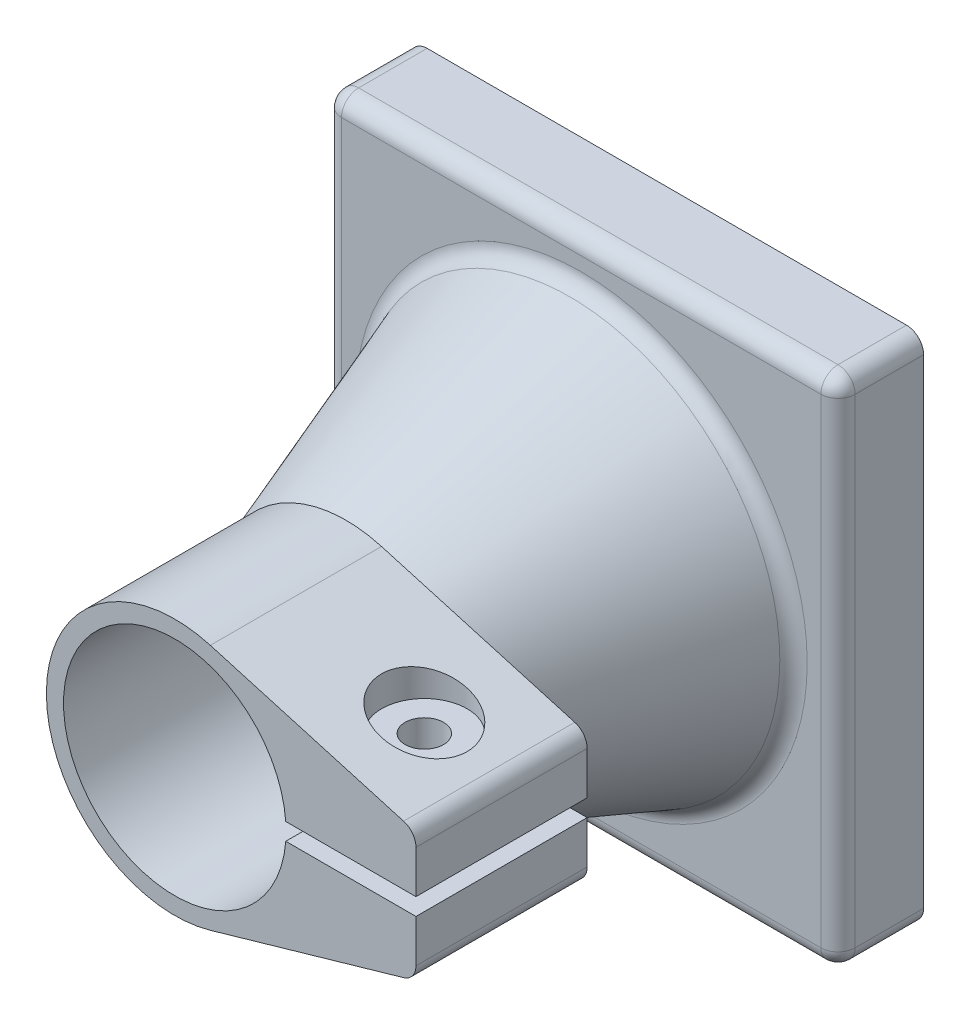
ISO-10303-21;
HEADER;
FILE_DESCRIPTION(('STEP AP214'),'2;1');
FILE_NAME('part.step','',(''),(''),'','','');
FILE_SCHEMA(('AUTOMOTIVE_DESIGN { 1 0 10303 214 1 1 1 1 }'));
ENDSEC;
DATA;
#1=APPLICATION_CONTEXT('core data for automotive mechanical design processes');
#2=APPLICATION_PROTOCOL_DEFINITION('international standard','automotive_design',2000,#1);
#3=PRODUCT_CONTEXT('',#1,'mechanical');
#4=PRODUCT('Part','Part','',(#3));
#5=PRODUCT_RELATED_PRODUCT_CATEGORY('part','',(#4));
#6=PRODUCT_DEFINITION_FORMATION('','',#4);
#7=PRODUCT_DEFINITION_CONTEXT('part definition',#1,'design');
#8=PRODUCT_DEFINITION('design','',#6,#7);
#9=PRODUCT_DEFINITION_SHAPE('','',#8);
#10=(LENGTH_UNIT() NAMED_UNIT(*) SI_UNIT(.MILLI.,.METRE.));
#11=(NAMED_UNIT(*) PLANE_ANGLE_UNIT() SI_UNIT($,.RADIAN.));
#12=(NAMED_UNIT(*) SI_UNIT($,.STERADIAN.) SOLID_ANGLE_UNIT());
#13=UNCERTAINTY_MEASURE_WITH_UNIT(LENGTH_MEASURE(1.E-05),#10,'distance_accuracy_value','');
#14=(GEOMETRIC_REPRESENTATION_CONTEXT(3) GLOBAL_UNCERTAINTY_ASSIGNED_CONTEXT((#13)) GLOBAL_UNIT_ASSIGNED_CONTEXT((#10,
#11,#12)) REPRESENTATION_CONTEXT('',''));
#15=CARTESIAN_POINT('',(0.,0.,0.));
#16=DIRECTION('',(0.,0.,1.));
#17=DIRECTION('',(1.,0.,0.));
#18=AXIS2_PLACEMENT_3D('',#15,#16,#17);
#19=CARTESIAN_POINT('',(19.1488859578134,-16.5906320768049,47.4747741945465));
#20=DIRECTION('',(0.,1.,0.));
#21=DIRECTION('',(0.,0.,1.));
#22=AXIS2_PLACEMENT_3D('',#19,#20,#21);
#23=CYLINDRICAL_SURFACE('',#22,2.25);
#24=CARTESIAN_POINT('',(19.1488859578134,1.,47.4747741945465));
#25=DIRECTION('',(0.,1.,0.));
#26=DIRECTION('',(-1.,0.,0.));
#27=AXIS2_PLACEMENT_3D('',#24,#25,#26);
#28=CIRCLE('',#27,2.25);
#29=CARTESIAN_POINT('',(16.8988859578134,1.,47.4747741945465));
#30=VERTEX_POINT('',#29);
#31=EDGE_CURVE('E217',#30,#30,#28,.F.);
#32=ORIENTED_EDGE('',*,*,#31,.T.);
#33=EDGE_LOOP('',(#32));
#34=FACE_BOUND('',#33,.T.);
#35=CARTESIAN_POINT('',(19.1488859578134,8.,47.4747741945465));
#36=DIRECTION('',(0.,1.,0.));
#37=DIRECTION('',(0.,0.,1.));
#38=AXIS2_PLACEMENT_3D('',#35,#36,#37);
#39=CIRCLE('',#38,2.25);
#40=CARTESIAN_POINT('',(19.1488859578134,8.,49.7247741945465));
#41=VERTEX_POINT('',#40);
#42=EDGE_CURVE('E227',#41,#41,#39,.F.);
#43=ORIENTED_EDGE('',*,*,#42,.F.);
#44=EDGE_LOOP('',(#43));
#45=FACE_BOUND('',#44,.T.);
#46=ADVANCED_FACE('F35',(#34,#45),#23,.F.);
#47=CARTESIAN_POINT('',(28.1735691739616,7.5,37.4747741945464));
#48=DIRECTION('',(1.,0.,0.));
#49=DIRECTION('',(0.,0.,-1.));
#50=AXIS2_PLACEMENT_3D('',#47,#48,#49);
#51=PLANE('',#50);
#52=DIRECTION('',(0.,0.,1.));
#53=VECTOR('',#52,1.);
#54=CARTESIAN_POINT('',(28.1735691739616,1.,22.1317753175475));
#55=LINE('',#54,#53);
#56=CARTESIAN_POINT('',(28.1735691739616,1.,37.4747741945464));
#57=VERTEX_POINT('',#56);
#58=CARTESIAN_POINT('',(28.1735691739616,1.,57.4747741945465));
#59=VERTEX_POINT('',#58);
#60=EDGE_CURVE('E211',#57,#59,#55,.T.);
#61=ORIENTED_EDGE('',*,*,#60,.F.);
#62=DIRECTION('',(0.,1.,0.));
#63=VECTOR('',#62,1.);
#64=CARTESIAN_POINT('',(28.1735691739616,7.5,37.4747741945464));
#65=LINE('',#64,#63);
#66=CARTESIAN_POINT('',(28.1735691739616,5.99444923726153,37.4747741945464));
#67=VERTEX_POINT('',#66);
#68=EDGE_CURVE('E235',#57,#67,#65,.T.);
#69=ORIENTED_EDGE('',*,*,#68,.T.);
#70=DIRECTION('',(0.,0.,1.));
#71=VECTOR('',#70,1.);
#72=CARTESIAN_POINT('',(28.1735691739616,5.99444923726153,37.4747741945464));
#73=LINE('',#72,#71);
#74=CARTESIAN_POINT('',(28.1735691739616,5.99444923726153,57.4747741945465));
#75=VERTEX_POINT('',#74);
#76=EDGE_CURVE('E366',#67,#75,#73,.T.);
#77=ORIENTED_EDGE('',*,*,#76,.T.);
#78=DIRECTION('',(0.,1.,0.));
#79=VECTOR('',#78,1.);
#80=CARTESIAN_POINT('',(28.1735691739616,7.5,57.4747741945465));
#81=LINE('',#80,#79);
#82=EDGE_CURVE('E245',#59,#75,#81,.T.);
#83=ORIENTED_EDGE('',*,*,#82,.F.);
#84=EDGE_LOOP('',(#61,#69,#77,#83));
#85=FACE_BOUND('',#84,.T.);
#86=ADVANCED_FACE('F409',(#85),#51,.T.);
#87=CARTESIAN_POINT('',(0.,0.,37.4747741945464));
#88=DIRECTION('',(0.,0.,-1.));
#89=DIRECTION('',(-1.,0.,0.));
#90=AXIS2_PLACEMENT_3D('',#87,#88,#89);
#91=PLANE('',#90);
#92=DIRECTION('',(-1.,0.,0.));
#93=VECTOR('',#92,1.);
#94=CARTESIAN_POINT('',(28.1735691739616,1.,37.4747741945464));
#95=LINE('',#94,#93);
#96=CARTESIAN_POINT('',(14.9666295470958,0.999999999999998,37.4747741945464));
#97=VERTEX_POINT('',#96);
#98=EDGE_CURVE('E190',#57,#97,#95,.T.);
#99=ORIENTED_EDGE('',*,*,#98,.T.);
#100=CARTESIAN_POINT('',(0.,0.,37.4747741945464));
#101=DIRECTION('',(0.,0.,-1.));
#102=DIRECTION('',(-1.,0.,0.));
#103=AXIS2_PLACEMENT_3D('',#100,#101,#102);
#104=CIRCLE('',#103,15.);
#105=CARTESIAN_POINT('',(4.14888595781337,14.4148099296889,37.4747741945464));
#106=VERTEX_POINT('',#105);
#107=EDGE_CURVE('E229',#106,#97,#104,.T.);
#108=ORIENTED_EDGE('',*,*,#107,.F.);
#109=DIRECTION('',(-0.96098732864593,0.276592397187558,0.));
#110=VECTOR('',#109,1.);
#111=CARTESIAN_POINT('',(4.14888595781337,14.4148099296889,37.4747741945464));
#112=LINE('',#111,#110);
#113=CARTESIAN_POINT('',(26.7267539683367,7.91642389455339,37.4747741945464));
#114=VERTEX_POINT('',#113);
#115=EDGE_CURVE('E239',#114,#106,#112,.T.);
#116=ORIENTED_EDGE('',*,*,#115,.F.);
#117=CARTESIAN_POINT('',(26.1735691739616,5.99444923726153,37.4747741945464));
#118=DIRECTION('',(0.,0.,-1.));
#119=DIRECTION('',(-1.,0.,0.));
#120=AXIS2_PLACEMENT_3D('',#117,#118,#119);
#121=CIRCLE('',#120,2.);
#122=EDGE_CURVE('E376',#114,#67,#121,.T.);
#123=ORIENTED_EDGE('',*,*,#122,.T.);
#124=ORIENTED_EDGE('',*,*,#68,.F.);
#125=EDGE_LOOP('',(#99,#108,#116,#123,#124));
#126=FACE_BOUND('',#125,.T.);
#127=ADVANCED_FACE('F415',(#126),#91,.T.);
#128=CARTESIAN_POINT('',(4.14888595781337,-14.4148099296889,37.4747741945464));
#129=DIRECTION('',(0.276592397187558,-0.96098732864593,0.));
#130=DIRECTION('',(0.96098732864593,0.276592397187558,0.));
#131=AXIS2_PLACEMENT_3D('',#128,#129,#130);
#132=PLANE('',#131);
#133=DIRECTION('',(0.96098732864593,0.276592397187558,0.));
#134=VECTOR('',#133,1.);
#135=CARTESIAN_POINT('',(4.14888595781337,-14.4148099296889,37.4747741945464));
#136=LINE('',#135,#134);
#137=CARTESIAN_POINT('',(4.14888595781337,-14.4148099296889,37.4747741945464));
#138=VERTEX_POINT('',#137);
#139=CARTESIAN_POINT('',(26.7267539683367,-7.91642389455339,37.4747741945464));
#140=VERTEX_POINT('',#139);
#141=EDGE_CURVE('E232',#138,#140,#136,.T.);
#142=ORIENTED_EDGE('',*,*,#141,.T.);
#143=DIRECTION('',(0.,0.,1.));
#144=VECTOR('',#143,1.);
#145=CARTESIAN_POINT('',(26.7267539683367,-7.91642389455339,37.4747741945464));
#146=LINE('',#145,#144);
#147=CARTESIAN_POINT('',(26.7267539683367,-7.91642389455339,57.4747741945465));
#148=VERTEX_POINT('',#147);
#149=EDGE_CURVE('E43',#140,#148,#146,.T.);
#150=ORIENTED_EDGE('',*,*,#149,.T.);
#151=DIRECTION('',(0.96098732864593,0.276592397187558,0.));
#152=VECTOR('',#151,1.);
#153=CARTESIAN_POINT('',(4.14888595781337,-14.4148099296889,57.4747741945465));
#154=LINE('',#153,#152);
#155=CARTESIAN_POINT('',(4.14888595781337,-14.4148099296889,57.4747741945465));
#156=VERTEX_POINT('',#155);
#157=EDGE_CURVE('E242',#156,#148,#154,.T.);
#158=ORIENTED_EDGE('',*,*,#157,.F.);
#159=DIRECTION('',(0.,0.,1.));
#160=VECTOR('',#159,1.);
#161=CARTESIAN_POINT('',(4.14888595781337,-14.4148099296889,37.4747741945464));
#162=LINE('',#161,#160);
#163=EDGE_CURVE('E241',#138,#156,#162,.T.);
#164=ORIENTED_EDGE('',*,*,#163,.F.);
#165=EDGE_LOOP('',(#142,#150,#158,#164));
#166=FACE_BOUND('',#165,.T.);
#167=CARTESIAN_POINT('',(19.1488859578134,-10.0974939421209,47.4747741945465));
#168=DIRECTION('',(0.276592397187558,-0.96098732864593,0.));
#169=DIRECTION('',(-0.96098732864593,-0.276592397187558,0.));
#170=AXIS2_PLACEMENT_3D('',#167,#168,#169);
#171=ELLIPSE('',#170,5.20298223603552,5.);
#172=CARTESIAN_POINT('',(14.1488859578134,-11.5365992713103,47.4747741945465));
#173=VERTEX_POINT('',#172);
#174=EDGE_CURVE('E223',#173,#173,#171,.F.);
#175=ORIENTED_EDGE('',*,*,#174,.T.);
#176=EDGE_LOOP('',(#175));
#177=FACE_BOUND('',#176,.T.);
#178=ADVANCED_FACE('F423',(#166,#177),#132,.T.);
#179=CARTESIAN_POINT('',(19.1488859578134,-0.999999999999999,47.4747741945465));
#180=DIRECTION('',(0.,-1.,0.));
#181=DIRECTION('',(1.,0.,0.));
#182=AXIS2_PLACEMENT_3D('',#179,#180,#181);
#183=CIRCLE('',#182,2.25);
#184=CARTESIAN_POINT('',(21.3988859578134,-0.999999999999999,47.4747741945465));
#185=VERTEX_POINT('',#184);
#186=EDGE_CURVE('E214',#185,#185,#183,.F.);
#187=ORIENTED_EDGE('',*,*,#186,.T.);
#188=EDGE_LOOP('',(#187));
#189=FACE_BOUND('',#188,.T.);
#190=CARTESIAN_POINT('',(19.1488859578134,-8.,47.4747741945465));
#191=DIRECTION('',(0.,1.,0.));
#192=DIRECTION('',(0.,0.,1.));
#193=AXIS2_PLACEMENT_3D('',#190,#191,#192);
#194=CIRCLE('',#193,2.25);
#195=CARTESIAN_POINT('',(19.1488859578134,-8.,49.7247741945465));
#196=VERTEX_POINT('',#195);
#197=EDGE_CURVE('E228',#196,#196,#194,.F.);
#198=ORIENTED_EDGE('',*,*,#197,.T.);
#199=EDGE_LOOP('',(#198));
#200=FACE_BOUND('',#199,.T.);
#201=ADVANCED_FACE('F389',(#189,#200),#23,.F.);
#202=CARTESIAN_POINT('',(0.,0.,10.));
#203=DIRECTION('',(0.,0.,1.));
#204=DIRECTION('',(1.,0.,0.));
#205=AXIS2_PLACEMENT_3D('',#202,#203,#204);
#206=PLANE('',#205);
#207=CARTESIAN_POINT('',(0.,0.,10.));
#208=DIRECTION('',(0.,0.,1.));
#209=DIRECTION('',(1.,0.,0.));
#210=AXIS2_PLACEMENT_3D('',#207,#208,#209);
#211=CIRCLE('',#210,26.4004150764194);
#212=CARTESIAN_POINT('',(26.4004150764194,0.,10.));
#213=VERTEX_POINT('',#212);
#214=EDGE_CURVE('E297',#213,#213,#211,.F.);
#215=ORIENTED_EDGE('',*,*,#214,.T.);
#216=EDGE_LOOP('',(#215));
#217=FACE_BOUND('',#216,.T.);
#218=DIRECTION('',(0.,1.,0.));
#219=VECTOR('',#218,1.);
#220=CARTESIAN_POINT('',(28.,30.,10.));
#221=LINE('',#220,#219);
#222=CARTESIAN_POINT('',(28.,-28.,10.));
#223=VERTEX_POINT('',#222);
#224=CARTESIAN_POINT('',(28.,28.,10.));
#225=VERTEX_POINT('',#224);
#226=EDGE_CURVE('E291',#223,#225,#221,.T.);
#227=ORIENTED_EDGE('',*,*,#226,.T.);
#228=DIRECTION('',(-1.,0.,0.));
#229=VECTOR('',#228,1.);
#230=CARTESIAN_POINT('',(-30.,28.,10.));
#231=LINE('',#230,#229);
#232=CARTESIAN_POINT('',(-28.,28.,10.));
#233=VERTEX_POINT('',#232);
#234=EDGE_CURVE('E294',#225,#233,#231,.T.);
#235=ORIENTED_EDGE('',*,*,#234,.T.);
#236=DIRECTION('',(0.,-1.,0.));
#237=VECTOR('',#236,1.);
#238=CARTESIAN_POINT('',(-28.,-30.,10.));
#239=LINE('',#238,#237);
#240=CARTESIAN_POINT('',(-28.,-28.,10.));
#241=VERTEX_POINT('',#240);
#242=EDGE_CURVE('E285',#233,#241,#239,.T.);
#243=ORIENTED_EDGE('',*,*,#242,.T.);
#244=DIRECTION('',(1.,0.,0.));
#245=VECTOR('',#244,1.);
#246=CARTESIAN_POINT('',(30.,-28.,10.));
#247=LINE('',#246,#245);
#248=EDGE_CURVE('E288',#241,#223,#247,.T.);
#249=ORIENTED_EDGE('',*,*,#248,.T.);
#250=EDGE_LOOP('',(#227,#235,#243,#249));
#251=FACE_BOUND('',#250,.T.);
#252=ADVANCED_FACE('F422',(#217,#251),#206,.T.);
#253=CARTESIAN_POINT('',(-30.,30.,10.));
#254=DIRECTION('',(1.,0.,0.));
#255=DIRECTION('',(0.,1.,0.));
#256=AXIS2_PLACEMENT_3D('',#253,#254,#255);
#257=PLANE('',#256);
#258=DIRECTION('',(0.,-1.,0.));
#259=VECTOR('',#258,1.);
#260=CARTESIAN_POINT('',(-30.,30.,0.));
#261=LINE('',#260,#259);
#262=CARTESIAN_POINT('',(-30.,28.,0.));
#263=VERTEX_POINT('',#262);
#264=CARTESIAN_POINT('',(-30.,-28.,0.));
#265=VERTEX_POINT('',#264);
#266=EDGE_CURVE('E269',#263,#265,#261,.T.);
#267=ORIENTED_EDGE('',*,*,#266,.T.);
#268=DIRECTION('',(0.,0.,-1.));
#269=VECTOR('',#268,1.);
#270=CARTESIAN_POINT('',(-30.,-28.,10.));
#271=LINE('',#270,#269);
#272=CARTESIAN_POINT('',(-30.,-28.,8.));
#273=VERTEX_POINT('',#272);
#274=EDGE_CURVE('E350',#265,#273,#271,.F.);
#275=ORIENTED_EDGE('',*,*,#274,.T.);
#276=DIRECTION('',(0.,-1.,0.));
#277=VECTOR('',#276,1.);
#278=CARTESIAN_POINT('',(-30.,30.,8.));
#279=LINE('',#278,#277);
#280=CARTESIAN_POINT('',(-30.,28.,8.));
#281=VERTEX_POINT('',#280);
#282=EDGE_CURVE('E309',#273,#281,#279,.F.);
#283=ORIENTED_EDGE('',*,*,#282,.T.);
#284=DIRECTION('',(0.,0.,-1.));
#285=VECTOR('',#284,1.);
#286=CARTESIAN_POINT('',(-30.,28.,10.));
#287=LINE('',#286,#285);
#288=EDGE_CURVE('E348',#281,#263,#287,.T.);
#289=ORIENTED_EDGE('',*,*,#288,.T.);
#290=EDGE_LOOP('',(#267,#275,#283,#289));
#291=FACE_BOUND('',#290,.T.);
#292=ADVANCED_FACE('F429',(#291),#257,.F.);
#293=CARTESIAN_POINT('',(-30.,-30.,10.));
#294=DIRECTION('',(0.,1.,0.));
#295=DIRECTION('',(0.,0.,1.));
#296=AXIS2_PLACEMENT_3D('',#293,#294,#295);
#297=PLANE('',#296);
#298=DIRECTION('',(1.,0.,0.));
#299=VECTOR('',#298,1.);
#300=CARTESIAN_POINT('',(-30.,-30.,0.));
#301=LINE('',#300,#299);
#302=CARTESIAN_POINT('',(-28.,-30.,0.));
#303=VERTEX_POINT('',#302);
#304=CARTESIAN_POINT('',(28.,-30.,0.));
#305=VERTEX_POINT('',#304);
#306=EDGE_CURVE('E273',#303,#305,#301,.T.);
#307=ORIENTED_EDGE('',*,*,#306,.T.);
#308=DIRECTION('',(0.,0.,-1.));
#309=VECTOR('',#308,1.);
#310=CARTESIAN_POINT('',(28.,-30.,10.));
#311=LINE('',#310,#309);
#312=CARTESIAN_POINT('',(28.,-30.,8.));
#313=VERTEX_POINT('',#312);
#314=EDGE_CURVE('E346',#305,#313,#311,.F.);
#315=ORIENTED_EDGE('',*,*,#314,.T.);
#316=DIRECTION('',(1.,0.,0.));
#317=VECTOR('',#316,1.);
#318=CARTESIAN_POINT('',(-30.,-30.,8.));
#319=LINE('',#318,#317);
#320=CARTESIAN_POINT('',(-28.,-30.,8.));
#321=VERTEX_POINT('',#320);
#322=EDGE_CURVE('E306',#313,#321,#319,.F.);
#323=ORIENTED_EDGE('',*,*,#322,.T.);
#324=DIRECTION('',(0.,0.,-1.));
#325=VECTOR('',#324,1.);
#326=CARTESIAN_POINT('',(-28.,-30.,10.));
#327=LINE('',#326,#325);
#328=EDGE_CURVE('E344',#321,#303,#327,.T.);
#329=ORIENTED_EDGE('',*,*,#328,.T.);
#330=EDGE_LOOP('',(#307,#315,#323,#329));
#331=FACE_BOUND('',#330,.T.);
#332=ADVANCED_FACE('F729',(#331),#297,.F.);
#333=CARTESIAN_POINT('',(30.,30.,10.));
#334=DIRECTION('',(-1.,0.,0.));
#335=DIRECTION('',(0.,-1.,0.));
#336=AXIS2_PLACEMENT_3D('',#333,#334,#335);
#337=PLANE('',#336);
#338=DIRECTION('',(0.,1.,0.));
#339=VECTOR('',#338,1.);
#340=CARTESIAN_POINT('',(30.,-30.,8.));
#341=LINE('',#340,#339);
#342=CARTESIAN_POINT('',(30.,28.,8.));
#343=VERTEX_POINT('',#342);
#344=CARTESIAN_POINT('',(30.,-28.,8.));
#345=VERTEX_POINT('',#344);
#346=EDGE_CURVE('E303',#343,#345,#341,.F.);
#347=ORIENTED_EDGE('',*,*,#346,.T.);
#348=DIRECTION('',(0.,0.,-1.));
#349=VECTOR('',#348,1.);
#350=CARTESIAN_POINT('',(30.,-28.,10.));
#351=LINE('',#350,#349);
#352=CARTESIAN_POINT('',(30.,-28.,0.));
#353=VERTEX_POINT('',#352);
#354=EDGE_CURVE('E334',#345,#353,#351,.T.);
#355=ORIENTED_EDGE('',*,*,#354,.T.);
#356=DIRECTION('',(0.,1.,0.));
#357=VECTOR('',#356,1.);
#358=CARTESIAN_POINT('',(30.,30.,0.));
#359=LINE('',#358,#357);
#360=CARTESIAN_POINT('',(30.,28.,0.));
#361=VERTEX_POINT('',#360);
#362=EDGE_CURVE('E276',#353,#361,#359,.T.);
#363=ORIENTED_EDGE('',*,*,#362,.T.);
#364=DIRECTION('',(0.,0.,-1.));
#365=VECTOR('',#364,1.);
#366=CARTESIAN_POINT('',(30.,28.,10.));
#367=LINE('',#366,#365);
#368=EDGE_CURVE('E332',#361,#343,#367,.F.);
#369=ORIENTED_EDGE('',*,*,#368,.T.);
#370=EDGE_LOOP('',(#347,#355,#363,#369));
#371=FACE_BOUND('',#370,.T.);
#372=ADVANCED_FACE('F721',(#371),#337,.F.);
#373=CARTESIAN_POINT('',(-30.,30.,10.));
#374=DIRECTION('',(0.,-1.,0.));
#375=DIRECTION('',(0.,0.,-1.));
#376=AXIS2_PLACEMENT_3D('',#373,#374,#375);
#377=PLANE('',#376);
#378=DIRECTION('',(-1.,0.,0.));
#379=VECTOR('',#378,1.);
#380=CARTESIAN_POINT('',(30.,30.,8.));
#381=LINE('',#380,#379);
#382=CARTESIAN_POINT('',(-28.,30.,8.));
#383=VERTEX_POINT('',#382);
#384=CARTESIAN_POINT('',(28.,30.,8.));
#385=VERTEX_POINT('',#384);
#386=EDGE_CURVE('E300',#383,#385,#381,.F.);
#387=ORIENTED_EDGE('',*,*,#386,.T.);
#388=DIRECTION('',(0.,0.,-1.));
#389=VECTOR('',#388,1.);
#390=CARTESIAN_POINT('',(28.,30.,10.));
#391=LINE('',#390,#389);
#392=CARTESIAN_POINT('',(28.,30.,0.));
#393=VERTEX_POINT('',#392);
#394=EDGE_CURVE('E354',#385,#393,#391,.T.);
#395=ORIENTED_EDGE('',*,*,#394,.T.);
#396=DIRECTION('',(-1.,0.,0.));
#397=VECTOR('',#396,1.);
#398=CARTESIAN_POINT('',(-30.,30.,0.));
#399=LINE('',#398,#397);
#400=CARTESIAN_POINT('',(-28.,30.,0.));
#401=VERTEX_POINT('',#400);
#402=EDGE_CURVE('E279',#393,#401,#399,.T.);
#403=ORIENTED_EDGE('',*,*,#402,.T.);
#404=DIRECTION('',(0.,0.,-1.));
#405=VECTOR('',#404,1.);
#406=CARTESIAN_POINT('',(-28.,30.,10.));
#407=LINE('',#406,#405);
#408=EDGE_CURVE('E352',#401,#383,#407,.F.);
#409=ORIENTED_EDGE('',*,*,#408,.T.);
#410=EDGE_LOOP('',(#387,#395,#403,#409));
#411=FACE_BOUND('',#410,.T.);
#412=ADVANCED_FACE('F713',(#411),#377,.F.);
#413=CARTESIAN_POINT('',(0.,0.,0.));
#414=DIRECTION('',(0.,0.,1.));
#415=DIRECTION('',(1.,0.,0.));
#416=AXIS2_PLACEMENT_3D('',#413,#414,#415);
#417=PLANE('',#416);
#418=ORIENTED_EDGE('',*,*,#362,.F.);
#419=CARTESIAN_POINT('',(28.,-28.,0.));
#420=DIRECTION('',(0.,0.,1.));
#421=DIRECTION('',(1.,0.,0.));
#422=AXIS2_PLACEMENT_3D('',#419,#420,#421);
#423=CIRCLE('',#422,2.);
#424=EDGE_CURVE('E342',#353,#305,#423,.F.);
#425=ORIENTED_EDGE('',*,*,#424,.T.);
#426=ORIENTED_EDGE('',*,*,#306,.F.);
#427=CARTESIAN_POINT('',(-28.,-28.,0.));
#428=DIRECTION('',(0.,0.,1.));
#429=DIRECTION('',(1.,0.,0.));
#430=AXIS2_PLACEMENT_3D('',#427,#428,#429);
#431=CIRCLE('',#430,2.);
#432=EDGE_CURVE('E340',#303,#265,#431,.F.);
#433=ORIENTED_EDGE('',*,*,#432,.T.);
#434=ORIENTED_EDGE('',*,*,#266,.F.);
#435=CARTESIAN_POINT('',(-28.,28.,0.));
#436=DIRECTION('',(0.,0.,1.));
#437=DIRECTION('',(1.,0.,0.));
#438=AXIS2_PLACEMENT_3D('',#435,#436,#437);
#439=CIRCLE('',#438,2.);
#440=EDGE_CURVE('E336',#263,#401,#439,.F.);
#441=ORIENTED_EDGE('',*,*,#440,.T.);
#442=ORIENTED_EDGE('',*,*,#402,.F.);
#443=CARTESIAN_POINT('',(28.,28.,0.));
#444=DIRECTION('',(0.,0.,1.));
#445=DIRECTION('',(1.,0.,0.));
#446=AXIS2_PLACEMENT_3D('',#443,#444,#445);
#447=CIRCLE('',#446,2.);
#448=EDGE_CURVE('E338',#393,#361,#447,.F.);
#449=ORIENTED_EDGE('',*,*,#448,.T.);
#450=EDGE_LOOP('',(#418,#425,#426,#433,#434,#441,#442,#449));
#451=FACE_BOUND('',#450,.T.);
#452=ADVANCED_FACE('F706',(#451),#417,.F.);
#453=CARTESIAN_POINT('',(0.,0.,10.));
#454=DIRECTION('',(0.,0.,-1.));
#455=DIRECTION('',(-1.,0.,0.));
#456=AXIS2_PLACEMENT_3D('',#453,#454,#455);
#457=CONICAL_SURFACE('',#456,25.,0.349065850398863);
#458=CARTESIAN_POINT('',(0.,0.,11.3159597133487));
#459=DIRECTION('',(0.,0.,1.));
#460=DIRECTION('',(1.,0.,0.));
#461=AXIS2_PLACEMENT_3D('',#458,#459,#460);
#462=CIRCLE('',#461,24.5210298348476);
#463=CARTESIAN_POINT('',(24.5210298348476,0.,11.3159597133487));
#464=VERTEX_POINT('',#463);
#465=EDGE_CURVE('E282',#464,#464,#462,.T.);
#466=ORIENTED_EDGE('',*,*,#465,.T.);
#467=EDGE_LOOP('',(#466));
#468=FACE_BOUND('',#467,.T.);
#469=CARTESIAN_POINT('',(0.,0.,37.4747741945464));
#470=DIRECTION('',(0.,0.,1.));
#471=DIRECTION('',(1.,0.,0.));
#472=AXIS2_PLACEMENT_3D('',#469,#470,#471);
#473=CIRCLE('',#472,15.);
#474=EDGE_CURVE('E266',#106,#138,#473,.T.);
#475=ORIENTED_EDGE('',*,*,#474,.F.);
#476=ORIENTED_EDGE('',*,*,#107,.T.);
#477=CARTESIAN_POINT('',(14.9666295470958,-0.999999999999998,37.4747741945464));
#478=VERTEX_POINT('',#477);
#479=EDGE_CURVE('E187',#97,#478,#104,.T.);
#480=ORIENTED_EDGE('',*,*,#479,.T.);
#481=EDGE_CURVE('E233',#478,#138,#104,.T.);
#482=ORIENTED_EDGE('',*,*,#481,.T.);
#483=EDGE_LOOP('',(#475,#476,#480,#482));
#484=FACE_BOUND('',#483,.T.);
#485=ADVANCED_FACE('F698',(#468,#484),#457,.T.);
#486=CARTESIAN_POINT('',(0.,0.,12.));
#487=DIRECTION('',(0.,0.,1.));
#488=DIRECTION('',(1.,0.,0.));
#489=AXIS2_PLACEMENT_3D('',#486,#487,#488);
#490=TOROIDAL_SURFACE('',#489,26.4004150764194,2.);
#491=ORIENTED_EDGE('',*,*,#214,.F.);
#492=EDGE_LOOP('',(#491));
#493=FACE_BOUND('',#492,.T.);
#494=ORIENTED_EDGE('',*,*,#465,.F.);
#495=EDGE_LOOP('',(#494));
#496=FACE_BOUND('',#495,.T.);
#497=ADVANCED_FACE('F689',(#493,#496),#490,.F.);
#498=CARTESIAN_POINT('',(0.,-28.,8.));
#499=DIRECTION('',(-1.,0.,0.));
#500=DIRECTION('',(0.,0.,1.));
#501=AXIS2_PLACEMENT_3D('',#498,#499,#500);
#502=CYLINDRICAL_SURFACE('',#501,2.);
#503=ORIENTED_EDGE('',*,*,#322,.F.);
#504=CARTESIAN_POINT('',(28.,-28.,8.));
#505=DIRECTION('',(-1.,0.,0.));
#506=DIRECTION('',(0.,0.,1.));
#507=AXIS2_PLACEMENT_3D('',#504,#505,#506);
#508=CIRCLE('',#507,2.);
#509=EDGE_CURVE('E319',#313,#223,#508,.T.);
#510=ORIENTED_EDGE('',*,*,#509,.T.);
#511=ORIENTED_EDGE('',*,*,#248,.F.);
#512=CARTESIAN_POINT('',(-28.,-28.,8.));
#513=DIRECTION('',(-1.,0.,0.));
#514=DIRECTION('',(0.,0.,1.));
#515=AXIS2_PLACEMENT_3D('',#512,#513,#514);
#516=CIRCLE('',#515,2.);
#517=EDGE_CURVE('E317',#241,#321,#516,.F.);
#518=ORIENTED_EDGE('',*,*,#517,.T.);
#519=EDGE_LOOP('',(#503,#510,#511,#518));
#520=FACE_BOUND('',#519,.T.);
#521=ADVANCED_FACE('F681',(#520),#502,.T.);
#522=CARTESIAN_POINT('',(28.,0.,8.));
#523=DIRECTION('',(0.,-1.,0.));
#524=DIRECTION('',(1.,0.,0.));
#525=AXIS2_PLACEMENT_3D('',#522,#523,#524);
#526=CYLINDRICAL_SURFACE('',#525,2.);
#527=ORIENTED_EDGE('',*,*,#226,.F.);
#528=CARTESIAN_POINT('',(28.,-28.,8.));
#529=DIRECTION('',(0.,-1.,0.));
#530=DIRECTION('',(1.,0.,0.));
#531=AXIS2_PLACEMENT_3D('',#528,#529,#530);
#532=CIRCLE('',#531,2.);
#533=EDGE_CURVE('E314',#223,#345,#532,.F.);
#534=ORIENTED_EDGE('',*,*,#533,.T.);
#535=ORIENTED_EDGE('',*,*,#346,.F.);
#536=CARTESIAN_POINT('',(28.,28.,8.));
#537=DIRECTION('',(0.,-1.,0.));
#538=DIRECTION('',(1.,0.,0.));
#539=AXIS2_PLACEMENT_3D('',#536,#537,#538);
#540=CIRCLE('',#539,2.);
#541=EDGE_CURVE('E312',#343,#225,#540,.T.);
#542=ORIENTED_EDGE('',*,*,#541,.T.);
#543=EDGE_LOOP('',(#527,#534,#535,#542));
#544=FACE_BOUND('',#543,.T.);
#545=ADVANCED_FACE('F673',(#544),#526,.T.);
#546=CARTESIAN_POINT('',(-28.,0.,8.));
#547=DIRECTION('',(0.,1.,0.));
#548=DIRECTION('',(-1.,0.,0.));
#549=AXIS2_PLACEMENT_3D('',#546,#547,#548);
#550=CYLINDRICAL_SURFACE('',#549,2.);
#551=ORIENTED_EDGE('',*,*,#282,.F.);
#552=CARTESIAN_POINT('',(-28.,-28.,8.));
#553=DIRECTION('',(0.,1.,0.));
#554=DIRECTION('',(-1.,0.,0.));
#555=AXIS2_PLACEMENT_3D('',#552,#553,#554);
#556=CIRCLE('',#555,2.);
#557=EDGE_CURVE('E323',#273,#241,#556,.T.);
#558=ORIENTED_EDGE('',*,*,#557,.T.);
#559=ORIENTED_EDGE('',*,*,#242,.F.);
#560=CARTESIAN_POINT('',(-28.,28.,8.));
#561=DIRECTION('',(0.,1.,0.));
#562=DIRECTION('',(-1.,0.,0.));
#563=AXIS2_PLACEMENT_3D('',#560,#561,#562);
#564=CIRCLE('',#563,2.);
#565=EDGE_CURVE('E321',#233,#281,#564,.F.);
#566=ORIENTED_EDGE('',*,*,#565,.T.);
#567=EDGE_LOOP('',(#551,#558,#559,#566));
#568=FACE_BOUND('',#567,.T.);
#569=ADVANCED_FACE('F665',(#568),#550,.T.);
#570=CARTESIAN_POINT('',(0.,28.,8.));
#571=DIRECTION('',(1.,0.,0.));
#572=DIRECTION('',(0.,0.,-1.));
#573=AXIS2_PLACEMENT_3D('',#570,#571,#572);
#574=CYLINDRICAL_SURFACE('',#573,2.);
#575=ORIENTED_EDGE('',*,*,#234,.F.);
#576=CARTESIAN_POINT('',(28.,28.,8.));
#577=DIRECTION('',(1.,0.,0.));
#578=DIRECTION('',(0.,0.,-1.));
#579=AXIS2_PLACEMENT_3D('',#576,#577,#578);
#580=CIRCLE('',#579,2.);
#581=EDGE_CURVE('E329',#225,#385,#580,.F.);
#582=ORIENTED_EDGE('',*,*,#581,.T.);
#583=ORIENTED_EDGE('',*,*,#386,.F.);
#584=CARTESIAN_POINT('',(-28.,28.,8.));
#585=DIRECTION('',(1.,0.,0.));
#586=DIRECTION('',(0.,0.,-1.));
#587=AXIS2_PLACEMENT_3D('',#584,#585,#586);
#588=CIRCLE('',#587,2.);
#589=EDGE_CURVE('E326',#383,#233,#588,.T.);
#590=ORIENTED_EDGE('',*,*,#589,.T.);
#591=EDGE_LOOP('',(#575,#582,#583,#590));
#592=FACE_BOUND('',#591,.T.);
#593=ADVANCED_FACE('F657',(#592),#574,.T.);
#594=CARTESIAN_POINT('',(28.,-28.,10.));
#595=DIRECTION('',(0.,0.,-1.));
#596=DIRECTION('',(-1.,0.,0.));
#597=AXIS2_PLACEMENT_3D('',#594,#595,#596);
#598=CYLINDRICAL_SURFACE('',#597,2.);
#599=ORIENTED_EDGE('',*,*,#424,.F.);
#600=ORIENTED_EDGE('',*,*,#354,.F.);
#601=CARTESIAN_POINT('',(28.,-28.,8.));
#602=DIRECTION('',(0.,0.,1.));
#603=DIRECTION('',(1.,0.,0.));
#604=AXIS2_PLACEMENT_3D('',#601,#602,#603);
#605=CIRCLE('',#604,2.);
#606=EDGE_CURVE('E270',#313,#345,#605,.T.);
#607=ORIENTED_EDGE('',*,*,#606,.F.);
#608=ORIENTED_EDGE('',*,*,#314,.F.);
#609=EDGE_LOOP('',(#599,#600,#607,#608));
#610=FACE_BOUND('',#609,.T.);
#611=ADVANCED_FACE('F649',(#610),#598,.T.);
#612=CARTESIAN_POINT('',(28.,-28.,8.));
#613=DIRECTION('',(0.,0.,1.));
#614=DIRECTION('',(1.,0.,0.));
#615=AXIS2_PLACEMENT_3D('',#612,#613,#614);
#616=SPHERICAL_SURFACE('',#615,2.);
#617=ORIENTED_EDGE('',*,*,#533,.F.);
#618=ORIENTED_EDGE('',*,*,#509,.F.);
#619=ORIENTED_EDGE('',*,*,#606,.T.);
#620=EDGE_LOOP('',(#617,#618,#619));
#621=FACE_BOUND('',#620,.T.);
#622=ADVANCED_FACE('F641',(#621),#616,.T.);
#623=CARTESIAN_POINT('',(-28.,-28.,10.));
#624=DIRECTION('',(0.,0.,-1.));
#625=DIRECTION('',(-1.,0.,0.));
#626=AXIS2_PLACEMENT_3D('',#623,#624,#625);
#627=CYLINDRICAL_SURFACE('',#626,2.);
#628=ORIENTED_EDGE('',*,*,#432,.F.);
#629=ORIENTED_EDGE('',*,*,#328,.F.);
#630=CARTESIAN_POINT('',(-28.,-28.,8.));
#631=DIRECTION('',(0.,0.,1.));
#632=DIRECTION('',(1.,0.,0.));
#633=AXIS2_PLACEMENT_3D('',#630,#631,#632);
#634=CIRCLE('',#633,2.);
#635=EDGE_CURVE('E358',#273,#321,#634,.T.);
#636=ORIENTED_EDGE('',*,*,#635,.F.);
#637=ORIENTED_EDGE('',*,*,#274,.F.);
#638=EDGE_LOOP('',(#628,#629,#636,#637));
#639=FACE_BOUND('',#638,.T.);
#640=ADVANCED_FACE('F633',(#639),#627,.T.);
#641=CARTESIAN_POINT('',(-28.,-28.,8.));
#642=DIRECTION('',(0.,0.,1.));
#643=DIRECTION('',(1.,0.,0.));
#644=AXIS2_PLACEMENT_3D('',#641,#642,#643);
#645=SPHERICAL_SURFACE('',#644,2.);
#646=ORIENTED_EDGE('',*,*,#635,.T.);
#647=ORIENTED_EDGE('',*,*,#517,.F.);
#648=ORIENTED_EDGE('',*,*,#557,.F.);
#649=EDGE_LOOP('',(#646,#647,#648));
#650=FACE_BOUND('',#649,.T.);
#651=ADVANCED_FACE('F625',(#650),#645,.T.);
#652=CARTESIAN_POINT('',(28.,28.,10.));
#653=DIRECTION('',(0.,0.,-1.));
#654=DIRECTION('',(-1.,0.,0.));
#655=AXIS2_PLACEMENT_3D('',#652,#653,#654);
#656=CYLINDRICAL_SURFACE('',#655,2.);
#657=ORIENTED_EDGE('',*,*,#448,.F.);
#658=ORIENTED_EDGE('',*,*,#394,.F.);
#659=CARTESIAN_POINT('',(28.,28.,8.));
#660=DIRECTION('',(0.,0.,1.));
#661=DIRECTION('',(1.,0.,0.));
#662=AXIS2_PLACEMENT_3D('',#659,#660,#661);
#663=CIRCLE('',#662,2.);
#664=EDGE_CURVE('E361',#343,#385,#663,.T.);
#665=ORIENTED_EDGE('',*,*,#664,.F.);
#666=ORIENTED_EDGE('',*,*,#368,.F.);
#667=EDGE_LOOP('',(#657,#658,#665,#666));
#668=FACE_BOUND('',#667,.T.);
#669=ADVANCED_FACE('F617',(#668),#656,.T.);
#670=CARTESIAN_POINT('',(28.,28.,8.));
#671=DIRECTION('',(0.,0.,1.));
#672=DIRECTION('',(1.,0.,0.));
#673=AXIS2_PLACEMENT_3D('',#670,#671,#672);
#674=SPHERICAL_SURFACE('',#673,2.);
#675=ORIENTED_EDGE('',*,*,#581,.F.);
#676=ORIENTED_EDGE('',*,*,#541,.F.);
#677=ORIENTED_EDGE('',*,*,#664,.T.);
#678=EDGE_LOOP('',(#675,#676,#677));
#679=FACE_BOUND('',#678,.T.);
#680=ADVANCED_FACE('F609',(#679),#674,.T.);
#681=CARTESIAN_POINT('',(-28.,28.,10.));
#682=DIRECTION('',(0.,0.,-1.));
#683=DIRECTION('',(-1.,0.,0.));
#684=AXIS2_PLACEMENT_3D('',#681,#682,#683);
#685=CYLINDRICAL_SURFACE('',#684,2.);
#686=ORIENTED_EDGE('',*,*,#440,.F.);
#687=ORIENTED_EDGE('',*,*,#288,.F.);
#688=CARTESIAN_POINT('',(-28.,28.,8.));
#689=DIRECTION('',(0.,0.,1.));
#690=DIRECTION('',(1.,0.,0.));
#691=AXIS2_PLACEMENT_3D('',#688,#689,#690);
#692=CIRCLE('',#691,2.);
#693=EDGE_CURVE('E265',#383,#281,#692,.T.);
#694=ORIENTED_EDGE('',*,*,#693,.F.);
#695=ORIENTED_EDGE('',*,*,#408,.F.);
#696=EDGE_LOOP('',(#686,#687,#694,#695));
#697=FACE_BOUND('',#696,.T.);
#698=ADVANCED_FACE('F602',(#697),#685,.T.);
#699=CARTESIAN_POINT('',(-28.,28.,8.));
#700=DIRECTION('',(0.,0.,1.));
#701=DIRECTION('',(1.,0.,0.));
#702=AXIS2_PLACEMENT_3D('',#699,#700,#701);
#703=SPHERICAL_SURFACE('',#702,2.);
#704=ORIENTED_EDGE('',*,*,#693,.T.);
#705=ORIENTED_EDGE('',*,*,#565,.F.);
#706=ORIENTED_EDGE('',*,*,#589,.F.);
#707=EDGE_LOOP('',(#704,#705,#706));
#708=FACE_BOUND('',#707,.T.);
#709=ADVANCED_FACE('F559',(#708),#703,.T.);
#710=CARTESIAN_POINT('',(0.,0.,57.4747741945465));
#711=DIRECTION('',(0.,0.,1.));
#712=DIRECTION('',(1.,0.,0.));
#713=AXIS2_PLACEMENT_3D('',#710,#711,#712);
#714=PLANE('',#713);
#715=DIRECTION('',(-1.,0.,0.));
#716=VECTOR('',#715,1.);
#717=CARTESIAN_POINT('',(28.1735691739616,1.,57.4747741945465));
#718=LINE('',#717,#716);
#719=CARTESIAN_POINT('',(12.9614813968157,0.999999999999998,57.4747741945465));
#720=VERTEX_POINT('',#719);
#721=EDGE_CURVE('E198',#59,#720,#718,.T.);
#722=ORIENTED_EDGE('',*,*,#721,.F.);
#723=ORIENTED_EDGE('',*,*,#82,.T.);
#724=CARTESIAN_POINT('',(26.1735691739616,5.99444923726153,57.4747741945465));
#725=DIRECTION('',(0.,0.,1.));
#726=DIRECTION('',(1.,0.,0.));
#727=AXIS2_PLACEMENT_3D('',#724,#725,#726);
#728=CIRCLE('',#727,2.);
#729=CARTESIAN_POINT('',(26.7267539683367,7.91642389455339,57.4747741945465));
#730=VERTEX_POINT('',#729);
#731=EDGE_CURVE('E371',#75,#730,#728,.T.);
#732=ORIENTED_EDGE('',*,*,#731,.T.);
#733=DIRECTION('',(-0.96098732864593,0.276592397187558,0.));
#734=VECTOR('',#733,1.);
#735=CARTESIAN_POINT('',(4.14888595781337,14.4148099296889,57.4747741945465));
#736=LINE('',#735,#734);
#737=CARTESIAN_POINT('',(4.14888595781337,14.4148099296889,57.4747741945465));
#738=VERTEX_POINT('',#737);
#739=EDGE_CURVE('E250',#730,#738,#736,.T.);
#740=ORIENTED_EDGE('',*,*,#739,.T.);
#741=CARTESIAN_POINT('',(0.,0.,57.4747741945465));
#742=DIRECTION('',(0.,0.,1.));
#743=DIRECTION('',(1.,0.,0.));
#744=AXIS2_PLACEMENT_3D('',#741,#742,#743);
#745=CIRCLE('',#744,15.);
#746=EDGE_CURVE('E262',#738,#156,#745,.T.);
#747=ORIENTED_EDGE('',*,*,#746,.T.);
#748=ORIENTED_EDGE('',*,*,#157,.T.);
#749=CARTESIAN_POINT('',(26.1735691739616,-5.99444923726153,57.4747741945465));
#750=DIRECTION('',(0.,0.,1.));
#751=DIRECTION('',(1.,0.,0.));
#752=AXIS2_PLACEMENT_3D('',#749,#750,#751);
#753=CIRCLE('',#752,2.);
#754=CARTESIAN_POINT('',(28.1735691739616,-5.99444923726153,57.4747741945465));
#755=VERTEX_POINT('',#754);
#756=EDGE_CURVE('E369',#148,#755,#753,.T.);
#757=ORIENTED_EDGE('',*,*,#756,.T.);
#758=CARTESIAN_POINT('',(28.1735691739616,-1.,57.4747741945465));
#759=VERTEX_POINT('',#758);
#760=EDGE_CURVE('E247',#755,#759,#81,.T.);
#761=ORIENTED_EDGE('',*,*,#760,.T.);
#762=DIRECTION('',(1.,0.,0.));
#763=VECTOR('',#762,1.);
#764=CARTESIAN_POINT('',(28.1735691739616,-1.,57.4747741945465));
#765=LINE('',#764,#763);
#766=CARTESIAN_POINT('',(12.9614813968157,-0.999999999999996,57.4747741945465));
#767=VERTEX_POINT('',#766);
#768=EDGE_CURVE('E191',#767,#759,#765,.T.);
#769=ORIENTED_EDGE('',*,*,#768,.F.);
#770=CARTESIAN_POINT('',(0.,0.,57.4747741945465));
#771=DIRECTION('',(0.,0.,1.));
#772=DIRECTION('',(1.,0.,0.));
#773=AXIS2_PLACEMENT_3D('',#770,#771,#772);
#774=CIRCLE('',#773,13.);
#775=EDGE_CURVE('E260',#720,#767,#774,.T.);
#776=ORIENTED_EDGE('',*,*,#775,.F.);
#777=EDGE_LOOP('',(#722,#723,#732,#740,#747,#748,#757,#761,#769,#776));
#778=FACE_BOUND('',#777,.T.);
#779=ADVANCED_FACE('F551',(#778),#714,.T.);
#780=CARTESIAN_POINT('',(0.,0.,57.4747741945465));
#781=DIRECTION('',(0.,0.,-1.));
#782=DIRECTION('',(-1.,0.,0.));
#783=AXIS2_PLACEMENT_3D('',#780,#781,#782);
#784=CYLINDRICAL_SURFACE('',#783,15.);
#785=ORIENTED_EDGE('',*,*,#746,.F.);
#786=DIRECTION('',(0.,0.,1.));
#787=VECTOR('',#786,1.);
#788=CARTESIAN_POINT('',(4.14888595781337,14.4148099296889,37.4747741945464));
#789=LINE('',#788,#787);
#790=EDGE_CURVE('E252',#106,#738,#789,.T.);
#791=ORIENTED_EDGE('',*,*,#790,.F.);
#792=ORIENTED_EDGE('',*,*,#474,.T.);
#793=ORIENTED_EDGE('',*,*,#163,.T.);
#794=EDGE_LOOP('',(#785,#791,#792,#793));
#795=FACE_BOUND('',#794,.T.);
#796=ADVANCED_FACE('F558',(#795),#784,.T.);
#797=CARTESIAN_POINT('',(0.,0.,57.4747741945465));
#798=DIRECTION('',(0.,0.,-1.));
#799=DIRECTION('',(-1.,0.,0.));
#800=AXIS2_PLACEMENT_3D('',#797,#798,#799);
#801=CYLINDRICAL_SURFACE('',#800,13.);
#802=DIRECTION('',(0.,0.,1.));
#803=VECTOR('',#802,1.);
#804=CARTESIAN_POINT('',(12.9614813968157,0.999999999999998,22.1317753175475));
#805=LINE('',#804,#803);
#806=CARTESIAN_POINT('',(12.9614813968157,0.999999999999998,37.4747741945464));
#807=VERTEX_POINT('',#806);
#808=EDGE_CURVE('E194',#807,#720,#805,.T.);
#809=ORIENTED_EDGE('',*,*,#808,.T.);
#810=ORIENTED_EDGE('',*,*,#775,.T.);
#811=DIRECTION('',(0.,0.,1.));
#812=VECTOR('',#811,1.);
#813=CARTESIAN_POINT('',(12.9614813968157,-0.999999999999996,22.1317753175475));
#814=LINE('',#813,#812);
#815=CARTESIAN_POINT('',(12.9614813968157,-0.999999999999996,37.4747741945464));
#816=VERTEX_POINT('',#815);
#817=EDGE_CURVE('E205',#816,#767,#814,.T.);
#818=ORIENTED_EDGE('',*,*,#817,.F.);
#819=CARTESIAN_POINT('',(0.,0.,37.4747741945464));
#820=DIRECTION('',(0.,0.,-1.));
#821=DIRECTION('',(-1.,0.,0.));
#822=AXIS2_PLACEMENT_3D('',#819,#820,#821);
#823=CIRCLE('',#822,13.);
#824=EDGE_CURVE('E184',#807,#816,#823,.T.);
#825=ORIENTED_EDGE('',*,*,#824,.F.);
#826=EDGE_LOOP('',(#809,#810,#818,#825));
#827=FACE_BOUND('',#826,.T.);
#828=CARTESIAN_POINT('',(0.,0.,17.4747741945465));
#829=DIRECTION('',(0.,0.,1.));
#830=DIRECTION('',(1.,0.,0.));
#831=AXIS2_PLACEMENT_3D('',#828,#829,#830);
#832=CIRCLE('',#831,13.);
#833=CARTESIAN_POINT('',(13.,0.,17.4747741945465));
#834=VERTEX_POINT('',#833);
#835=EDGE_CURVE('E255',#834,#834,#832,.T.);
#836=ORIENTED_EDGE('',*,*,#835,.F.);
#837=EDGE_LOOP('',(#836));
#838=FACE_BOUND('',#837,.T.);
#839=ADVANCED_FACE('F203',(#827,#838),#801,.F.);
#840=CARTESIAN_POINT('',(0.,0.,17.4747741945465));
#841=DIRECTION('',(0.,0.,1.));
#842=DIRECTION('',(1.,0.,0.));
#843=AXIS2_PLACEMENT_3D('',#840,#841,#842);
#844=PLANE('',#843);
#845=ORIENTED_EDGE('',*,*,#835,.T.);
#846=EDGE_LOOP('',(#845));
#847=FACE_BOUND('',#846,.T.);
#848=ADVANCED_FACE('F547',(#847),#844,.T.);
#849=CARTESIAN_POINT('',(4.14888595781337,14.4148099296889,37.4747741945464));
#850=DIRECTION('',(0.276592397187558,0.96098732864593,0.));
#851=DIRECTION('',(-0.96098732864593,0.276592397187558,0.));
#852=AXIS2_PLACEMENT_3D('',#849,#850,#851);
#853=PLANE('',#852);
#854=CARTESIAN_POINT('',(19.1488859578134,10.0974939421209,47.4747741945465));
#855=DIRECTION('',(0.276592397187558,0.96098732864593,0.));
#856=DIRECTION('',(-0.96098732864593,0.276592397187558,0.));
#857=AXIS2_PLACEMENT_3D('',#854,#855,#856);
#858=ELLIPSE('',#857,5.20298223603552,5.);
#859=CARTESIAN_POINT('',(14.1488859578134,11.5365992713103,47.4747741945465));
#860=VERTEX_POINT('',#859);
#861=EDGE_CURVE('E246',#860,#860,#858,.T.);
#862=ORIENTED_EDGE('',*,*,#861,.F.);
#863=EDGE_LOOP('',(#862));
#864=FACE_BOUND('',#863,.T.);
#865=ORIENTED_EDGE('',*,*,#739,.F.);
#866=DIRECTION('',(0.,0.,1.));
#867=VECTOR('',#866,1.);
#868=CARTESIAN_POINT('',(26.7267539683367,7.91642389455339,37.4747741945464));
#869=LINE('',#868,#867);
#870=EDGE_CURVE('E373',#730,#114,#869,.F.);
#871=ORIENTED_EDGE('',*,*,#870,.T.);
#872=ORIENTED_EDGE('',*,*,#115,.T.);
#873=ORIENTED_EDGE('',*,*,#790,.T.);
#874=EDGE_LOOP('',(#865,#871,#872,#873));
#875=FACE_BOUND('',#874,.T.);
#876=ADVANCED_FACE('F539',(#864,#875),#853,.T.);
#877=DIRECTION('',(0.,0.,1.));
#878=VECTOR('',#877,1.);
#879=CARTESIAN_POINT('',(28.1735691739616,-1.,22.1317753175475));
#880=LINE('',#879,#878);
#881=CARTESIAN_POINT('',(28.1735691739616,-1.,37.4747741945464));
#882=VERTEX_POINT('',#881);
#883=EDGE_CURVE('E49',#882,#759,#880,.T.);
#884=ORIENTED_EDGE('',*,*,#883,.T.);
#885=ORIENTED_EDGE('',*,*,#760,.F.);
#886=DIRECTION('',(0.,0.,1.));
#887=VECTOR('',#886,1.);
#888=CARTESIAN_POINT('',(28.1735691739616,-5.99444923726153,37.4747741945464));
#889=LINE('',#888,#887);
#890=CARTESIAN_POINT('',(28.1735691739616,-5.99444923726153,37.4747741945464));
#891=VERTEX_POINT('',#890);
#892=EDGE_CURVE('E356',#755,#891,#889,.F.);
#893=ORIENTED_EDGE('',*,*,#892,.T.);
#894=EDGE_CURVE('E236',#891,#882,#65,.T.);
#895=ORIENTED_EDGE('',*,*,#894,.T.);
#896=EDGE_LOOP('',(#884,#885,#893,#895));
#897=FACE_BOUND('',#896,.T.);
#898=ADVANCED_FACE('F418',(#897),#51,.T.);
#899=DIRECTION('',(-1.,0.,0.));
#900=VECTOR('',#899,1.);
#901=CARTESIAN_POINT('',(0.,-0.999999999999996,37.4747741945464));
#902=LINE('',#901,#900);
#903=EDGE_CURVE('E11',#882,#478,#902,.T.);
#904=ORIENTED_EDGE('',*,*,#903,.F.);
#905=ORIENTED_EDGE('',*,*,#894,.F.);
#906=CARTESIAN_POINT('',(26.1735691739616,-5.99444923726153,37.4747741945464));
#907=DIRECTION('',(0.,0.,-1.));
#908=DIRECTION('',(-1.,0.,0.));
#909=AXIS2_PLACEMENT_3D('',#906,#907,#908);
#910=CIRCLE('',#909,2.);
#911=EDGE_CURVE('E57',#891,#140,#910,.T.);
#912=ORIENTED_EDGE('',*,*,#911,.T.);
#913=ORIENTED_EDGE('',*,*,#141,.F.);
#914=ORIENTED_EDGE('',*,*,#481,.F.);
#915=EDGE_LOOP('',(#904,#905,#912,#913,#914));
#916=FACE_BOUND('',#915,.T.);
#917=ADVANCED_FACE('F479',(#916),#91,.T.);
#918=CARTESIAN_POINT('',(26.1735691739616,5.99444923726153,37.4747741945464));
#919=DIRECTION('',(0.,0.,1.));
#920=DIRECTION('',(1.,0.,0.));
#921=AXIS2_PLACEMENT_3D('',#918,#919,#920);
#922=CYLINDRICAL_SURFACE('',#921,2.);
#923=ORIENTED_EDGE('',*,*,#122,.F.);
#924=ORIENTED_EDGE('',*,*,#870,.F.);
#925=ORIENTED_EDGE('',*,*,#731,.F.);
#926=ORIENTED_EDGE('',*,*,#76,.F.);
#927=EDGE_LOOP('',(#923,#924,#925,#926));
#928=FACE_BOUND('',#927,.T.);
#929=ADVANCED_FACE('F518',(#928),#922,.T.);
#930=CARTESIAN_POINT('',(26.1735691739616,-5.99444923726153,37.4747741945464));
#931=DIRECTION('',(0.,0.,1.));
#932=DIRECTION('',(1.,0.,0.));
#933=AXIS2_PLACEMENT_3D('',#930,#931,#932);
#934=CYLINDRICAL_SURFACE('',#933,2.);
#935=ORIENTED_EDGE('',*,*,#911,.F.);
#936=ORIENTED_EDGE('',*,*,#892,.F.);
#937=ORIENTED_EDGE('',*,*,#756,.F.);
#938=ORIENTED_EDGE('',*,*,#149,.F.);
#939=EDGE_LOOP('',(#935,#936,#937,#938));
#940=FACE_BOUND('',#939,.T.);
#941=ADVANCED_FACE('F37',(#940),#934,.T.);
#942=CARTESIAN_POINT('',(19.1488859578134,8.,47.4747741945465));
#943=DIRECTION('',(0.,1.,0.));
#944=DIRECTION('',(0.,0.,1.));
#945=AXIS2_PLACEMENT_3D('',#942,#943,#944);
#946=PLANE('',#945);
#947=CARTESIAN_POINT('',(19.1488859578134,8.,47.4747741945465));
#948=DIRECTION('',(0.,1.,0.));
#949=DIRECTION('',(0.,0.,1.));
#950=AXIS2_PLACEMENT_3D('',#947,#948,#949);
#951=CIRCLE('',#950,5.);
#952=CARTESIAN_POINT('',(19.1488859578134,8.,52.4747741945464));
#953=VERTEX_POINT('',#952);
#954=EDGE_CURVE('E224',#953,#953,#951,.T.);
#955=ORIENTED_EDGE('',*,*,#954,.T.);
#956=EDGE_LOOP('',(#955));
#957=FACE_BOUND('',#956,.T.);
#958=ORIENTED_EDGE('',*,*,#42,.T.);
#959=EDGE_LOOP('',(#958));
#960=FACE_BOUND('',#959,.T.);
#961=ADVANCED_FACE('F403',(#957,#960),#946,.T.);
#962=CARTESIAN_POINT('',(19.1488859578134,8.,47.4747741945465));
#963=DIRECTION('',(0.,1.,0.));
#964=DIRECTION('',(0.,0.,1.));
#965=AXIS2_PLACEMENT_3D('',#962,#963,#964);
#966=CYLINDRICAL_SURFACE('',#965,5.);
#967=ORIENTED_EDGE('',*,*,#861,.T.);
#968=EDGE_LOOP('',(#967));
#969=FACE_BOUND('',#968,.T.);
#970=ORIENTED_EDGE('',*,*,#954,.F.);
#971=EDGE_LOOP('',(#970));
#972=FACE_BOUND('',#971,.T.);
#973=ADVANCED_FACE('F394',(#969,#972),#966,.F.);
#974=CARTESIAN_POINT('',(19.1488859578134,-8.,47.4747741945465));
#975=DIRECTION('',(0.,1.,0.));
#976=DIRECTION('',(0.,0.,1.));
#977=AXIS2_PLACEMENT_3D('',#974,#975,#976);
#978=PLANE('',#977);
#979=CARTESIAN_POINT('',(19.1488859578134,-8.,47.4747741945465));
#980=DIRECTION('',(0.,1.,0.));
#981=DIRECTION('',(0.,0.,1.));
#982=AXIS2_PLACEMENT_3D('',#979,#980,#981);
#983=CIRCLE('',#982,5.);
#984=CARTESIAN_POINT('',(19.1488859578134,-8.,52.4747741945464));
#985=VERTEX_POINT('',#984);
#986=EDGE_CURVE('E220',#985,#985,#983,.T.);
#987=ORIENTED_EDGE('',*,*,#986,.F.);
#988=EDGE_LOOP('',(#987));
#989=FACE_BOUND('',#988,.T.);
#990=ORIENTED_EDGE('',*,*,#197,.F.);
#991=EDGE_LOOP('',(#990));
#992=FACE_BOUND('',#991,.T.);
#993=ADVANCED_FACE('F391',(#989,#992),#978,.F.);
#994=CARTESIAN_POINT('',(19.1488859578134,-8.,47.4747741945465));
#995=DIRECTION('',(0.,-1.,0.));
#996=DIRECTION('',(0.,0.,-1.));
#997=AXIS2_PLACEMENT_3D('',#994,#995,#996);
#998=CYLINDRICAL_SURFACE('',#997,5.);
#999=ORIENTED_EDGE('',*,*,#174,.F.);
#1000=EDGE_LOOP('',(#999));
#1001=FACE_BOUND('',#1000,.T.);
#1002=ORIENTED_EDGE('',*,*,#986,.T.);
#1003=EDGE_LOOP('',(#1002));
#1004=FACE_BOUND('',#1003,.T.);
#1005=ADVANCED_FACE('F393',(#1001,#1004),#998,.F.);
#1006=CARTESIAN_POINT('',(0.,0.,37.4747741945464));
#1007=DIRECTION('',(0.,0.,-1.));
#1008=DIRECTION('',(-1.,0.,0.));
#1009=AXIS2_PLACEMENT_3D('',#1006,#1007,#1008);
#1010=PLANE('',#1009);
#1011=EDGE_CURVE('E179',#97,#807,#95,.T.);
#1012=ORIENTED_EDGE('',*,*,#1011,.T.);
#1013=ORIENTED_EDGE('',*,*,#824,.T.);
#1014=DIRECTION('',(1.,0.,0.));
#1015=VECTOR('',#1014,1.);
#1016=CARTESIAN_POINT('',(28.1735691739616,-1.,37.4747741945464));
#1017=LINE('',#1016,#1015);
#1018=EDGE_CURVE('E207',#816,#478,#1017,.T.);
#1019=ORIENTED_EDGE('',*,*,#1018,.T.);
#1020=ORIENTED_EDGE('',*,*,#479,.F.);
#1021=EDGE_LOOP('',(#1012,#1013,#1019,#1020));
#1022=FACE_BOUND('',#1021,.T.);
#1023=ADVANCED_FACE('F181',(#1022),#1010,.F.);
#1024=CARTESIAN_POINT('',(28.1735691739616,1.,22.1317753175475));
#1025=DIRECTION('',(0.,1.,0.));
#1026=DIRECTION('',(-1.,0.,0.));
#1027=AXIS2_PLACEMENT_3D('',#1024,#1025,#1026);
#1028=PLANE('',#1027);
#1029=ORIENTED_EDGE('',*,*,#60,.T.);
#1030=ORIENTED_EDGE('',*,*,#721,.T.);
#1031=ORIENTED_EDGE('',*,*,#808,.F.);
#1032=ORIENTED_EDGE('',*,*,#1011,.F.);
#1033=ORIENTED_EDGE('',*,*,#98,.F.);
#1034=EDGE_LOOP('',(#1029,#1030,#1031,#1032,#1033));
#1035=FACE_BOUND('',#1034,.T.);
#1036=ORIENTED_EDGE('',*,*,#31,.F.);
#1037=EDGE_LOOP('',(#1036));
#1038=FACE_BOUND('',#1037,.T.);
#1039=ADVANCED_FACE('F195',(#1035,#1038),#1028,.F.);
#1040=CARTESIAN_POINT('',(28.1735691739616,-1.,22.1317753175475));
#1041=DIRECTION('',(0.,-1.,0.));
#1042=DIRECTION('',(1.,0.,0.));
#1043=AXIS2_PLACEMENT_3D('',#1040,#1041,#1042);
#1044=PLANE('',#1043);
#1045=ORIENTED_EDGE('',*,*,#817,.T.);
#1046=ORIENTED_EDGE('',*,*,#768,.T.);
#1047=ORIENTED_EDGE('',*,*,#883,.F.);
#1048=ORIENTED_EDGE('',*,*,#903,.T.);
#1049=ORIENTED_EDGE('',*,*,#1018,.F.);
#1050=EDGE_LOOP('',(#1045,#1046,#1047,#1048,#1049));
#1051=FACE_BOUND('',#1050,.T.);
#1052=ORIENTED_EDGE('',*,*,#186,.F.);
#1053=EDGE_LOOP('',(#1052));
#1054=FACE_BOUND('',#1053,.T.);
#1055=ADVANCED_FACE('F436',(#1051,#1054),#1044,.F.);
#1056=CLOSED_SHELL('',(#46,#86,#127,#178,#201,#252,#292,#332,#372,#412,#452,#485,#497,#521,#545,
#569,#593,#611,#622,#640,#651,#669,#680,#698,#709,#779,#796,#839,#848,#876,#898,#917,#929,#941,
#961,#973,#993,#1005,#1023,#1039,#1055));
#1057=MANIFOLD_SOLID_BREP('B2',#1056);
#1058=ADVANCED_BREP_SHAPE_REPRESENTATION('',(#18,#1057),#14);
#1059=SHAPE_DEFINITION_REPRESENTATION(#9,#1058);
ENDSEC;
END-ISO-10303-21;
